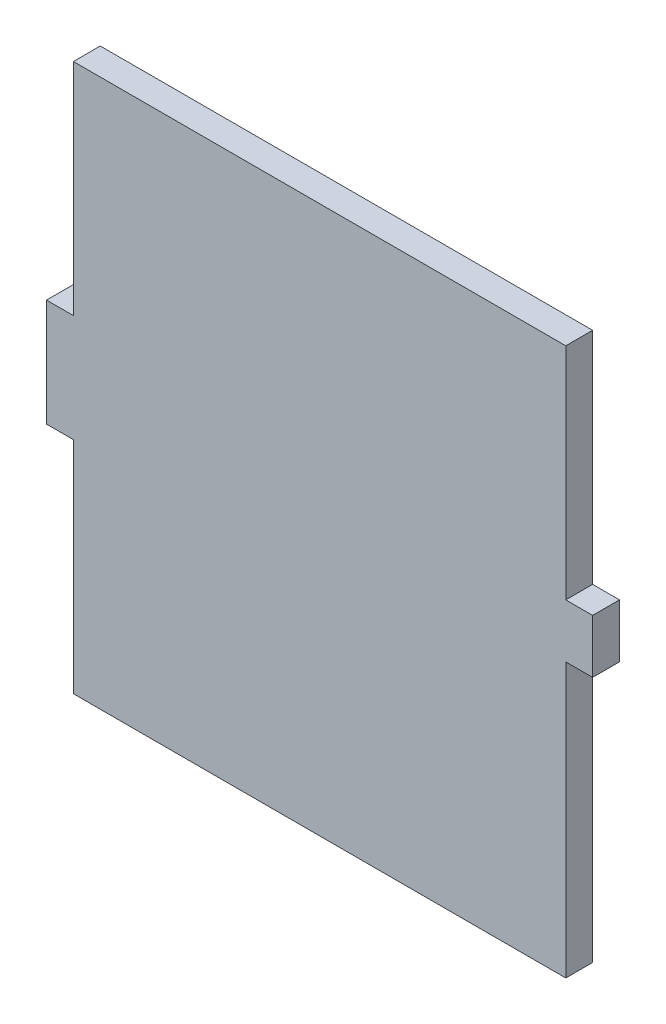
ISO-10303-21;
HEADER;
FILE_DESCRIPTION(('STEP AP214'),'2;1');
FILE_NAME('part.step','',(''),(''),'','','');
FILE_SCHEMA(('AUTOMOTIVE_DESIGN { 1 0 10303 214 1 1 1 1 }'));
ENDSEC;
DATA;
#1=APPLICATION_CONTEXT('core data for automotive mechanical design processes');
#2=APPLICATION_PROTOCOL_DEFINITION('international standard','automotive_design',2000,#1);
#3=PRODUCT_CONTEXT('',#1,'mechanical');
#4=PRODUCT('Part','Part','',(#3));
#5=PRODUCT_RELATED_PRODUCT_CATEGORY('part','',(#4));
#6=PRODUCT_DEFINITION_FORMATION('','',#4);
#7=PRODUCT_DEFINITION_CONTEXT('part definition',#1,'design');
#8=PRODUCT_DEFINITION('design','',#6,#7);
#9=PRODUCT_DEFINITION_SHAPE('','',#8);
#10=(LENGTH_UNIT() NAMED_UNIT(*) SI_UNIT(.MILLI.,.METRE.));
#11=(NAMED_UNIT(*) PLANE_ANGLE_UNIT() SI_UNIT($,.RADIAN.));
#12=(NAMED_UNIT(*) SI_UNIT($,.STERADIAN.) SOLID_ANGLE_UNIT());
#13=UNCERTAINTY_MEASURE_WITH_UNIT(LENGTH_MEASURE(1.E-05),#10,'distance_accuracy_value','');
#14=(GEOMETRIC_REPRESENTATION_CONTEXT(3) GLOBAL_UNCERTAINTY_ASSIGNED_CONTEXT((#13)) GLOBAL_UNIT_ASSIGNED_CONTEXT((#10,
#11,#12)) REPRESENTATION_CONTEXT('',''));
#15=CARTESIAN_POINT('',(0.,0.,0.));
#16=DIRECTION('',(0.,0.,1.));
#17=DIRECTION('',(1.,0.,0.));
#18=AXIS2_PLACEMENT_3D('',#15,#16,#17);
#19=CARTESIAN_POINT('',(0.,0.,3.));
#20=DIRECTION('',(1.,0.,0.));
#21=DIRECTION('',(0.,1.,0.));
#22=AXIS2_PLACEMENT_3D('',#19,#20,#21);
#23=PLANE('',#22);
#24=DIRECTION('',(0.,-1.,0.));
#25=VECTOR('',#24,1.);
#26=CARTESIAN_POINT('',(0.,0.,0.));
#27=LINE('',#26,#25);
#28=CARTESIAN_POINT('',(0.,0.,0.));
#29=VERTEX_POINT('',#28);
#30=CARTESIAN_POINT('',(0.,-24.58,0.));
#31=VERTEX_POINT('',#30);
#32=EDGE_CURVE('E159',#29,#31,#27,.T.);
#33=ORIENTED_EDGE('',*,*,#32,.T.);
#34=DIRECTION('',(0.,0.,-1.));
#35=VECTOR('',#34,1.);
#36=CARTESIAN_POINT('',(0.,-24.58,3.));
#37=LINE('',#36,#35);
#38=CARTESIAN_POINT('',(0.,-24.58,3.));
#39=VERTEX_POINT('',#38);
#40=EDGE_CURVE('E11',#39,#31,#37,.T.);
#41=ORIENTED_EDGE('',*,*,#40,.F.);
#42=DIRECTION('',(0.,-1.,0.));
#43=VECTOR('',#42,1.);
#44=CARTESIAN_POINT('',(0.,0.,3.));
#45=LINE('',#44,#43);
#46=CARTESIAN_POINT('',(0.,0.,3.));
#47=VERTEX_POINT('',#46);
#48=EDGE_CURVE('E181',#47,#39,#45,.T.);
#49=ORIENTED_EDGE('',*,*,#48,.F.);
#50=DIRECTION('',(0.,0.,-1.));
#51=VECTOR('',#50,1.);
#52=CARTESIAN_POINT('',(0.,0.,3.));
#53=LINE('',#52,#51);
#54=EDGE_CURVE('E155',#47,#29,#53,.T.);
#55=ORIENTED_EDGE('',*,*,#54,.T.);
#56=EDGE_LOOP('',(#33,#41,#49,#55));
#57=FACE_BOUND('',#56,.T.);
#58=ADVANCED_FACE('F39',(#57),#23,.F.);
#59=CARTESIAN_POINT('',(0.,-24.58,3.));
#60=DIRECTION('',(0.,-1.,0.));
#61=DIRECTION('',(0.,0.,-1.));
#62=AXIS2_PLACEMENT_3D('',#59,#60,#61);
#63=PLANE('',#62);
#64=DIRECTION('',(-1.,0.,0.));
#65=VECTOR('',#64,1.);
#66=CARTESIAN_POINT('',(0.,-24.58,0.));
#67=LINE('',#66,#65);
#68=CARTESIAN_POINT('',(-3.,-24.58,0.));
#69=VERTEX_POINT('',#68);
#70=EDGE_CURVE('E162',#31,#69,#67,.T.);
#71=ORIENTED_EDGE('',*,*,#70,.T.);
#72=DIRECTION('',(0.,0.,-1.));
#73=VECTOR('',#72,1.);
#74=CARTESIAN_POINT('',(-3.,-24.58,3.));
#75=LINE('',#74,#73);
#76=CARTESIAN_POINT('',(-3.,-24.58,3.));
#77=VERTEX_POINT('',#76);
#78=EDGE_CURVE('E47',#77,#69,#75,.T.);
#79=ORIENTED_EDGE('',*,*,#78,.F.);
#80=DIRECTION('',(-1.,0.,0.));
#81=VECTOR('',#80,1.);
#82=CARTESIAN_POINT('',(0.,-24.58,3.));
#83=LINE('',#82,#81);
#84=EDGE_CURVE('E110',#39,#77,#83,.T.);
#85=ORIENTED_EDGE('',*,*,#84,.F.);
#86=ORIENTED_EDGE('',*,*,#40,.T.);
#87=EDGE_LOOP('',(#71,#79,#85,#86));
#88=FACE_BOUND('',#87,.T.);
#89=ADVANCED_FACE('F259',(#88),#63,.F.);
#90=CARTESIAN_POINT('',(-3.,-24.58,3.));
#91=DIRECTION('',(1.,0.,0.));
#92=DIRECTION('',(0.,1.,0.));
#93=AXIS2_PLACEMENT_3D('',#90,#91,#92);
#94=PLANE('',#93);
#95=DIRECTION('',(0.,-1.,0.));
#96=VECTOR('',#95,1.);
#97=CARTESIAN_POINT('',(-3.,-24.58,0.));
#98=LINE('',#97,#96);
#99=CARTESIAN_POINT('',(-3.,-36.58,0.));
#100=VERTEX_POINT('',#99);
#101=EDGE_CURVE('E164',#69,#100,#98,.T.);
#102=ORIENTED_EDGE('',*,*,#101,.T.);
#103=DIRECTION('',(0.,0.,-1.));
#104=VECTOR('',#103,1.);
#105=CARTESIAN_POINT('',(-3.,-36.58,3.));
#106=LINE('',#105,#104);
#107=CARTESIAN_POINT('',(-3.,-36.58,3.));
#108=VERTEX_POINT('',#107);
#109=EDGE_CURVE('E200',#108,#100,#106,.T.);
#110=ORIENTED_EDGE('',*,*,#109,.F.);
#111=DIRECTION('',(0.,-1.,0.));
#112=VECTOR('',#111,1.);
#113=CARTESIAN_POINT('',(-3.,-24.58,3.));
#114=LINE('',#113,#112);
#115=EDGE_CURVE('E208',#77,#108,#114,.T.);
#116=ORIENTED_EDGE('',*,*,#115,.F.);
#117=ORIENTED_EDGE('',*,*,#78,.T.);
#118=EDGE_LOOP('',(#102,#110,#116,#117));
#119=FACE_BOUND('',#118,.T.);
#120=ADVANCED_FACE('F206',(#119),#94,.F.);
#121=CARTESIAN_POINT('',(0.,-36.58,3.));
#122=DIRECTION('',(0.,1.,0.));
#123=DIRECTION('',(0.,0.,1.));
#124=AXIS2_PLACEMENT_3D('',#121,#122,#123);
#125=PLANE('',#124);
#126=DIRECTION('',(1.,0.,0.));
#127=VECTOR('',#126,1.);
#128=CARTESIAN_POINT('',(0.,-36.58,0.));
#129=LINE('',#128,#127);
#130=CARTESIAN_POINT('',(0.,-36.58,0.));
#131=VERTEX_POINT('',#130);
#132=EDGE_CURVE('E166',#100,#131,#129,.T.);
#133=ORIENTED_EDGE('',*,*,#132,.T.);
#134=DIRECTION('',(0.,0.,-1.));
#135=VECTOR('',#134,1.);
#136=CARTESIAN_POINT('',(0.,-36.58,3.));
#137=LINE('',#136,#135);
#138=CARTESIAN_POINT('',(0.,-36.58,3.));
#139=VERTEX_POINT('',#138);
#140=EDGE_CURVE('E197',#139,#131,#137,.T.);
#141=ORIENTED_EDGE('',*,*,#140,.F.);
#142=DIRECTION('',(1.,0.,0.));
#143=VECTOR('',#142,1.);
#144=CARTESIAN_POINT('',(0.,-36.58,3.));
#145=LINE('',#144,#143);
#146=EDGE_CURVE('E226',#108,#139,#145,.T.);
#147=ORIENTED_EDGE('',*,*,#146,.F.);
#148=ORIENTED_EDGE('',*,*,#109,.T.);
#149=EDGE_LOOP('',(#133,#141,#147,#148));
#150=FACE_BOUND('',#149,.T.);
#151=ADVANCED_FACE('F217',(#150),#125,.F.);
#152=CARTESIAN_POINT('',(0.,-36.58,3.));
#153=DIRECTION('',(1.,0.,0.));
#154=DIRECTION('',(0.,1.,0.));
#155=AXIS2_PLACEMENT_3D('',#152,#153,#154);
#156=PLANE('',#155);
#157=DIRECTION('',(0.,-1.,0.));
#158=VECTOR('',#157,1.);
#159=CARTESIAN_POINT('',(0.,-36.58,0.));
#160=LINE('',#159,#158);
#161=CARTESIAN_POINT('',(0.,-61.16,0.));
#162=VERTEX_POINT('',#161);
#163=EDGE_CURVE('E168',#131,#162,#160,.T.);
#164=ORIENTED_EDGE('',*,*,#163,.T.);
#165=DIRECTION('',(0.,0.,-1.));
#166=VECTOR('',#165,1.);
#167=CARTESIAN_POINT('',(0.,-61.16,3.));
#168=LINE('',#167,#166);
#169=CARTESIAN_POINT('',(0.,-61.16,3.));
#170=VERTEX_POINT('',#169);
#171=EDGE_CURVE('E194',#170,#162,#168,.T.);
#172=ORIENTED_EDGE('',*,*,#171,.F.);
#173=DIRECTION('',(0.,-1.,0.));
#174=VECTOR('',#173,1.);
#175=CARTESIAN_POINT('',(0.,-36.58,3.));
#176=LINE('',#175,#174);
#177=EDGE_CURVE('E223',#139,#170,#176,.T.);
#178=ORIENTED_EDGE('',*,*,#177,.F.);
#179=ORIENTED_EDGE('',*,*,#140,.T.);
#180=EDGE_LOOP('',(#164,#172,#178,#179));
#181=FACE_BOUND('',#180,.T.);
#182=ADVANCED_FACE('F221',(#181),#156,.F.);
#183=CARTESIAN_POINT('',(0.,-61.16,3.));
#184=DIRECTION('',(0.,1.,0.));
#185=DIRECTION('',(0.,0.,1.));
#186=AXIS2_PLACEMENT_3D('',#183,#184,#185);
#187=PLANE('',#186);
#188=DIRECTION('',(1.,0.,0.));
#189=VECTOR('',#188,1.);
#190=CARTESIAN_POINT('',(0.,-61.16,0.));
#191=LINE('',#190,#189);
#192=CARTESIAN_POINT('',(55.,-61.16,0.));
#193=VERTEX_POINT('',#192);
#194=EDGE_CURVE('E170',#162,#193,#191,.T.);
#195=ORIENTED_EDGE('',*,*,#194,.T.);
#196=DIRECTION('',(0.,0.,-1.));
#197=VECTOR('',#196,1.);
#198=CARTESIAN_POINT('',(55.,-61.16,3.));
#199=LINE('',#198,#197);
#200=CARTESIAN_POINT('',(55.,-61.16,3.));
#201=VERTEX_POINT('',#200);
#202=EDGE_CURVE('E191',#201,#193,#199,.T.);
#203=ORIENTED_EDGE('',*,*,#202,.F.);
#204=DIRECTION('',(1.,0.,0.));
#205=VECTOR('',#204,1.);
#206=CARTESIAN_POINT('',(0.,-61.16,3.));
#207=LINE('',#206,#205);
#208=EDGE_CURVE('E225',#170,#201,#207,.T.);
#209=ORIENTED_EDGE('',*,*,#208,.F.);
#210=ORIENTED_EDGE('',*,*,#171,.T.);
#211=EDGE_LOOP('',(#195,#203,#209,#210));
#212=FACE_BOUND('',#211,.T.);
#213=ADVANCED_FACE('F272',(#212),#187,.F.);
#214=CARTESIAN_POINT('',(55.,-30.58,3.));
#215=DIRECTION('',(-1.,0.,0.));
#216=DIRECTION('',(0.,-1.,0.));
#217=AXIS2_PLACEMENT_3D('',#214,#215,#216);
#218=PLANE('',#217);
#219=DIRECTION('',(0.,1.,0.));
#220=VECTOR('',#219,1.);
#221=CARTESIAN_POINT('',(55.,-30.58,0.));
#222=LINE('',#221,#220);
#223=CARTESIAN_POINT('',(55.,-30.58,0.));
#224=VERTEX_POINT('',#223);
#225=EDGE_CURVE('E172',#193,#224,#222,.T.);
#226=ORIENTED_EDGE('',*,*,#225,.T.);
#227=DIRECTION('',(0.,0.,-1.));
#228=VECTOR('',#227,1.);
#229=CARTESIAN_POINT('',(55.,-30.58,3.));
#230=LINE('',#229,#228);
#231=CARTESIAN_POINT('',(55.,-30.58,3.));
#232=VERTEX_POINT('',#231);
#233=EDGE_CURVE('E188',#232,#224,#230,.T.);
#234=ORIENTED_EDGE('',*,*,#233,.F.);
#235=DIRECTION('',(0.,1.,0.));
#236=VECTOR('',#235,1.);
#237=CARTESIAN_POINT('',(55.,-30.58,3.));
#238=LINE('',#237,#236);
#239=EDGE_CURVE('E228',#201,#232,#238,.T.);
#240=ORIENTED_EDGE('',*,*,#239,.F.);
#241=ORIENTED_EDGE('',*,*,#202,.T.);
#242=EDGE_LOOP('',(#226,#234,#240,#241));
#243=FACE_BOUND('',#242,.T.);
#244=ADVANCED_FACE('F275',(#243),#218,.F.);
#245=CARTESIAN_POINT('',(55.,-30.58,3.));
#246=DIRECTION('',(0.,1.,0.));
#247=DIRECTION('',(0.,0.,1.));
#248=AXIS2_PLACEMENT_3D('',#245,#246,#247);
#249=PLANE('',#248);
#250=DIRECTION('',(1.,0.,0.));
#251=VECTOR('',#250,1.);
#252=CARTESIAN_POINT('',(55.,-30.58,0.));
#253=LINE('',#252,#251);
#254=CARTESIAN_POINT('',(58.,-30.58,0.));
#255=VERTEX_POINT('',#254);
#256=EDGE_CURVE('E174',#224,#255,#253,.T.);
#257=ORIENTED_EDGE('',*,*,#256,.T.);
#258=DIRECTION('',(0.,0.,-1.));
#259=VECTOR('',#258,1.);
#260=CARTESIAN_POINT('',(58.,-30.58,3.));
#261=LINE('',#260,#259);
#262=CARTESIAN_POINT('',(58.,-30.58,3.));
#263=VERTEX_POINT('',#262);
#264=EDGE_CURVE('E185',#263,#255,#261,.T.);
#265=ORIENTED_EDGE('',*,*,#264,.F.);
#266=DIRECTION('',(1.,0.,0.));
#267=VECTOR('',#266,1.);
#268=CARTESIAN_POINT('',(55.,-30.58,3.));
#269=LINE('',#268,#267);
#270=EDGE_CURVE('E234',#232,#263,#269,.T.);
#271=ORIENTED_EDGE('',*,*,#270,.F.);
#272=ORIENTED_EDGE('',*,*,#233,.T.);
#273=EDGE_LOOP('',(#257,#265,#271,#272));
#274=FACE_BOUND('',#273,.T.);
#275=ADVANCED_FACE('F240',(#274),#249,.F.);
#276=CARTESIAN_POINT('',(58.,-24.58,3.));
#277=DIRECTION('',(-1.,0.,0.));
#278=DIRECTION('',(0.,-1.,0.));
#279=AXIS2_PLACEMENT_3D('',#276,#277,#278);
#280=PLANE('',#279);
#281=DIRECTION('',(0.,1.,0.));
#282=VECTOR('',#281,1.);
#283=CARTESIAN_POINT('',(58.,-24.58,0.));
#284=LINE('',#283,#282);
#285=CARTESIAN_POINT('',(58.,-24.58,0.));
#286=VERTEX_POINT('',#285);
#287=EDGE_CURVE('E176',#255,#286,#284,.T.);
#288=ORIENTED_EDGE('',*,*,#287,.T.);
#289=DIRECTION('',(0.,0.,-1.));
#290=VECTOR('',#289,1.);
#291=CARTESIAN_POINT('',(58.,-24.58,3.));
#292=LINE('',#291,#290);
#293=CARTESIAN_POINT('',(58.,-24.58,3.));
#294=VERTEX_POINT('',#293);
#295=EDGE_CURVE('E150',#294,#286,#292,.T.);
#296=ORIENTED_EDGE('',*,*,#295,.F.);
#297=DIRECTION('',(0.,1.,0.));
#298=VECTOR('',#297,1.);
#299=CARTESIAN_POINT('',(58.,-24.58,3.));
#300=LINE('',#299,#298);
#301=EDGE_CURVE('E141',#263,#294,#300,.T.);
#302=ORIENTED_EDGE('',*,*,#301,.F.);
#303=ORIENTED_EDGE('',*,*,#264,.T.);
#304=EDGE_LOOP('',(#288,#296,#302,#303));
#305=FACE_BOUND('',#304,.T.);
#306=ADVANCED_FACE('F244',(#305),#280,.F.);
#307=CARTESIAN_POINT('',(55.,-24.58,3.));
#308=DIRECTION('',(0.,-1.,0.));
#309=DIRECTION('',(0.,0.,-1.));
#310=AXIS2_PLACEMENT_3D('',#307,#308,#309);
#311=PLANE('',#310);
#312=DIRECTION('',(-1.,0.,0.));
#313=VECTOR('',#312,1.);
#314=CARTESIAN_POINT('',(55.,-24.58,0.));
#315=LINE('',#314,#313);
#316=CARTESIAN_POINT('',(55.,-24.58,0.));
#317=VERTEX_POINT('',#316);
#318=EDGE_CURVE('E149',#286,#317,#315,.T.);
#319=ORIENTED_EDGE('',*,*,#318,.T.);
#320=DIRECTION('',(0.,0.,-1.));
#321=VECTOR('',#320,1.);
#322=CARTESIAN_POINT('',(55.,-24.58,3.));
#323=LINE('',#322,#321);
#324=CARTESIAN_POINT('',(55.,-24.58,3.));
#325=VERTEX_POINT('',#324);
#326=EDGE_CURVE('E146',#325,#317,#323,.T.);
#327=ORIENTED_EDGE('',*,*,#326,.F.);
#328=DIRECTION('',(-1.,0.,0.));
#329=VECTOR('',#328,1.);
#330=CARTESIAN_POINT('',(55.,-24.58,3.));
#331=LINE('',#330,#329);
#332=EDGE_CURVE('E135',#294,#325,#331,.T.);
#333=ORIENTED_EDGE('',*,*,#332,.F.);
#334=ORIENTED_EDGE('',*,*,#295,.T.);
#335=EDGE_LOOP('',(#319,#327,#333,#334));
#336=FACE_BOUND('',#335,.T.);
#337=ADVANCED_FACE('F147',(#336),#311,.F.);
#338=CARTESIAN_POINT('',(55.,0.,3.));
#339=DIRECTION('',(-1.,0.,0.));
#340=DIRECTION('',(0.,-1.,0.));
#341=AXIS2_PLACEMENT_3D('',#338,#339,#340);
#342=PLANE('',#341);
#343=DIRECTION('',(0.,1.,0.));
#344=VECTOR('',#343,1.);
#345=CARTESIAN_POINT('',(55.,0.,0.));
#346=LINE('',#345,#344);
#347=CARTESIAN_POINT('',(55.,0.,0.));
#348=VERTEX_POINT('',#347);
#349=EDGE_CURVE('E96',#317,#348,#346,.T.);
#350=ORIENTED_EDGE('',*,*,#349,.T.);
#351=DIRECTION('',(0.,0.,-1.));
#352=VECTOR('',#351,1.);
#353=CARTESIAN_POINT('',(55.,0.,3.));
#354=LINE('',#353,#352);
#355=CARTESIAN_POINT('',(55.,0.,3.));
#356=VERTEX_POINT('',#355);
#357=EDGE_CURVE('E151',#356,#348,#354,.T.);
#358=ORIENTED_EDGE('',*,*,#357,.F.);
#359=DIRECTION('',(0.,1.,0.));
#360=VECTOR('',#359,1.);
#361=CARTESIAN_POINT('',(55.,0.,3.));
#362=LINE('',#361,#360);
#363=EDGE_CURVE('E139',#325,#356,#362,.T.);
#364=ORIENTED_EDGE('',*,*,#363,.F.);
#365=ORIENTED_EDGE('',*,*,#326,.T.);
#366=EDGE_LOOP('',(#350,#358,#364,#365));
#367=FACE_BOUND('',#366,.T.);
#368=ADVANCED_FACE('F153',(#367),#342,.F.);
#369=CARTESIAN_POINT('',(0.,0.,3.));
#370=DIRECTION('',(0.,-1.,0.));
#371=DIRECTION('',(0.,0.,-1.));
#372=AXIS2_PLACEMENT_3D('',#369,#370,#371);
#373=PLANE('',#372);
#374=DIRECTION('',(-1.,0.,0.));
#375=VECTOR('',#374,1.);
#376=CARTESIAN_POINT('',(0.,0.,0.));
#377=LINE('',#376,#375);
#378=EDGE_CURVE('E102',#348,#29,#377,.T.);
#379=ORIENTED_EDGE('',*,*,#378,.T.);
#380=ORIENTED_EDGE('',*,*,#54,.F.);
#381=DIRECTION('',(-1.,0.,0.));
#382=VECTOR('',#381,1.);
#383=CARTESIAN_POINT('',(0.,0.,3.));
#384=LINE('',#383,#382);
#385=EDGE_CURVE('E55',#356,#47,#384,.T.);
#386=ORIENTED_EDGE('',*,*,#385,.F.);
#387=ORIENTED_EDGE('',*,*,#357,.T.);
#388=EDGE_LOOP('',(#379,#380,#386,#387));
#389=FACE_BOUND('',#388,.T.);
#390=ADVANCED_FACE('F248',(#389),#373,.F.);
#391=CARTESIAN_POINT('',(0.,0.,3.));
#392=DIRECTION('',(0.,0.,-1.));
#393=DIRECTION('',(-1.,0.,0.));
#394=AXIS2_PLACEMENT_3D('',#391,#392,#393);
#395=PLANE('',#394);
#396=ORIENTED_EDGE('',*,*,#48,.T.);
#397=ORIENTED_EDGE('',*,*,#84,.T.);
#398=ORIENTED_EDGE('',*,*,#115,.T.);
#399=ORIENTED_EDGE('',*,*,#146,.T.);
#400=ORIENTED_EDGE('',*,*,#177,.T.);
#401=ORIENTED_EDGE('',*,*,#208,.T.);
#402=ORIENTED_EDGE('',*,*,#239,.T.);
#403=ORIENTED_EDGE('',*,*,#270,.T.);
#404=ORIENTED_EDGE('',*,*,#301,.T.);
#405=ORIENTED_EDGE('',*,*,#332,.T.);
#406=ORIENTED_EDGE('',*,*,#363,.T.);
#407=ORIENTED_EDGE('',*,*,#385,.T.);
#408=EDGE_LOOP('',(#396,#397,#398,#399,#400,#401,#402,#403,#404,#405,#406,#407));
#409=FACE_BOUND('',#408,.T.);
#410=ADVANCED_FACE('F137',(#409),#395,.F.);
#411=CARTESIAN_POINT('',(0.,0.,0.));
#412=DIRECTION('',(0.,0.,-1.));
#413=DIRECTION('',(-1.,0.,0.));
#414=AXIS2_PLACEMENT_3D('',#411,#412,#413);
#415=PLANE('',#414);
#416=ORIENTED_EDGE('',*,*,#32,.F.);
#417=ORIENTED_EDGE('',*,*,#378,.F.);
#418=ORIENTED_EDGE('',*,*,#349,.F.);
#419=ORIENTED_EDGE('',*,*,#318,.F.);
#420=ORIENTED_EDGE('',*,*,#287,.F.);
#421=ORIENTED_EDGE('',*,*,#256,.F.);
#422=ORIENTED_EDGE('',*,*,#225,.F.);
#423=ORIENTED_EDGE('',*,*,#194,.F.);
#424=ORIENTED_EDGE('',*,*,#163,.F.);
#425=ORIENTED_EDGE('',*,*,#132,.F.);
#426=ORIENTED_EDGE('',*,*,#101,.F.);
#427=ORIENTED_EDGE('',*,*,#70,.F.);
#428=EDGE_LOOP('',(#416,#417,#418,#419,#420,#421,#422,#423,#424,#425,#426,#427));
#429=FACE_BOUND('',#428,.T.);
#430=ADVANCED_FACE('F212',(#429),#415,.T.);
#431=CLOSED_SHELL('',(#58,#89,#120,#151,#182,#213,#244,#275,#306,#337,#368,#390,#410,#430));
#432=MANIFOLD_SOLID_BREP('B2',#431);
#433=ADVANCED_BREP_SHAPE_REPRESENTATION('',(#18,#432),#14);
#434=SHAPE_DEFINITION_REPRESENTATION(#9,#433);
ENDSEC;
END-ISO-10303-21;
